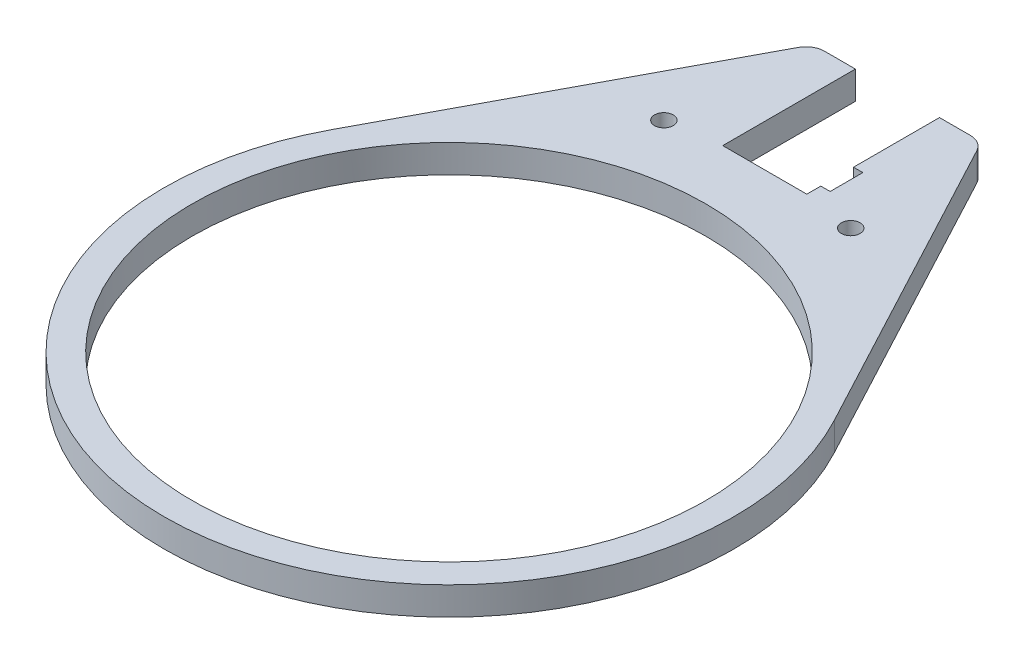
ISO-10303-21;
HEADER;
FILE_DESCRIPTION(('STEP AP214'),'2;1');
FILE_NAME('part.step','',(''),(''),'','','');
FILE_SCHEMA(('AUTOMOTIVE_DESIGN { 1 0 10303 214 1 1 1 1 }'));
ENDSEC;
DATA;
#1=APPLICATION_CONTEXT('core data for automotive mechanical design processes');
#2=APPLICATION_PROTOCOL_DEFINITION('international standard','automotive_design',2000,#1);
#3=PRODUCT_CONTEXT('',#1,'mechanical');
#4=PRODUCT('Part','Part','',(#3));
#5=PRODUCT_RELATED_PRODUCT_CATEGORY('part','',(#4));
#6=PRODUCT_DEFINITION_FORMATION('','',#4);
#7=PRODUCT_DEFINITION_CONTEXT('part definition',#1,'design');
#8=PRODUCT_DEFINITION('design','',#6,#7);
#9=PRODUCT_DEFINITION_SHAPE('','',#8);
#10=(LENGTH_UNIT() NAMED_UNIT(*) SI_UNIT(.MILLI.,.METRE.));
#11=(NAMED_UNIT(*) PLANE_ANGLE_UNIT() SI_UNIT($,.RADIAN.));
#12=(NAMED_UNIT(*) SI_UNIT($,.STERADIAN.) SOLID_ANGLE_UNIT());
#13=UNCERTAINTY_MEASURE_WITH_UNIT(LENGTH_MEASURE(1.E-05),#10,'distance_accuracy_value','');
#14=(GEOMETRIC_REPRESENTATION_CONTEXT(3) GLOBAL_UNCERTAINTY_ASSIGNED_CONTEXT((#13)) GLOBAL_UNIT_ASSIGNED_CONTEXT((#10,
#11,#12)) REPRESENTATION_CONTEXT('',''));
#15=CARTESIAN_POINT('',(0.,0.,0.));
#16=DIRECTION('',(0.,0.,1.));
#17=DIRECTION('',(1.,0.,0.));
#18=AXIS2_PLACEMENT_3D('',#15,#16,#17);
#19=CARTESIAN_POINT('',(4.5,3.,-62.2));
#20=DIRECTION('',(1.,0.,0.));
#21=DIRECTION('',(0.,0.,-1.));
#22=AXIS2_PLACEMENT_3D('',#19,#20,#21);
#23=PLANE('',#22);
#24=DIRECTION('',(0.,0.,1.));
#25=VECTOR('',#24,1.);
#26=CARTESIAN_POINT('',(4.5,0.,-62.2));
#27=LINE('',#26,#25);
#28=CARTESIAN_POINT('',(4.5,0.,-48.));
#29=VERTEX_POINT('',#28);
#30=CARTESIAN_POINT('',(4.5,0.,-38.8));
#31=VERTEX_POINT('',#30);
#32=EDGE_CURVE('E182',#29,#31,#27,.T.);
#33=ORIENTED_EDGE('',*,*,#32,.T.);
#34=DIRECTION('',(0.,1.,0.));
#35=VECTOR('',#34,1.);
#36=CARTESIAN_POINT('',(4.5,3.,-38.8));
#37=LINE('',#36,#35);
#38=CARTESIAN_POINT('',(4.5,3.,-38.8));
#39=VERTEX_POINT('',#38);
#40=EDGE_CURVE('E12',#31,#39,#37,.T.);
#41=ORIENTED_EDGE('',*,*,#40,.T.);
#42=DIRECTION('',(0.,0.,1.));
#43=VECTOR('',#42,1.);
#44=CARTESIAN_POINT('',(4.5,3.,-62.2));
#45=LINE('',#44,#43);
#46=CARTESIAN_POINT('',(4.5,3.,-48.));
#47=VERTEX_POINT('',#46);
#48=EDGE_CURVE('E172',#47,#39,#45,.T.);
#49=ORIENTED_EDGE('',*,*,#48,.F.);
#50=DIRECTION('',(0.,-1.,0.));
#51=VECTOR('',#50,1.);
#52=CARTESIAN_POINT('',(4.5,3.,-48.));
#53=LINE('',#52,#51);
#54=EDGE_CURVE('E247',#47,#29,#53,.T.);
#55=ORIENTED_EDGE('',*,*,#54,.T.);
#56=EDGE_LOOP('',(#33,#41,#49,#55));
#57=FACE_BOUND('',#56,.T.);
#58=ADVANCED_FACE('F37',(#57),#23,.F.);
#59=CARTESIAN_POINT('',(-7.79895069836721,3.,-48.));
#60=DIRECTION('',(0.,0.,-1.));
#61=DIRECTION('',(-1.,0.,0.));
#62=AXIS2_PLACEMENT_3D('',#59,#60,#61);
#63=PLANE('',#62);
#64=ORIENTED_EDGE('',*,*,#54,.F.);
#65=DIRECTION('',(1.,0.,0.));
#66=VECTOR('',#65,1.);
#67=CARTESIAN_POINT('',(-7.79895069836721,3.,-48.));
#68=LINE('',#67,#66);
#69=CARTESIAN_POINT('',(7.79895069836721,3.,-48.));
#70=VERTEX_POINT('',#69);
#71=EDGE_CURVE('E201',#47,#70,#68,.T.);
#72=ORIENTED_EDGE('',*,*,#71,.T.);
#73=DIRECTION('',(0.,-1.,0.));
#74=VECTOR('',#73,1.);
#75=CARTESIAN_POINT('',(7.79895069836721,3.,-48.));
#76=LINE('',#75,#74);
#77=CARTESIAN_POINT('',(7.79895069836721,0.,-48.));
#78=VERTEX_POINT('',#77);
#79=EDGE_CURVE('E232',#70,#78,#76,.T.);
#80=ORIENTED_EDGE('',*,*,#79,.T.);
#81=DIRECTION('',(1.,0.,0.));
#82=VECTOR('',#81,1.);
#83=CARTESIAN_POINT('',(-7.79895069836721,0.,-48.));
#84=LINE('',#83,#82);
#85=EDGE_CURVE('E217',#29,#78,#84,.T.);
#86=ORIENTED_EDGE('',*,*,#85,.F.);
#87=EDGE_LOOP('',(#64,#72,#80,#86));
#88=FACE_BOUND('',#87,.T.);
#89=ADVANCED_FACE('F287',(#88),#63,.T.);
#90=CARTESIAN_POINT('',(0.,1.,0.));
#91=DIRECTION('',(0.,-1.,0.));
#92=DIRECTION('',(0.,0.,-1.));
#93=AXIS2_PLACEMENT_3D('',#90,#91,#92);
#94=CYLINDRICAL_SURFACE('',#93,30.4999999999999);
#95=DIRECTION('',(0.,-1.,0.));
#96=VECTOR('',#95,1.);
#97=CARTESIAN_POINT('',(26.9228280798421,3.,-14.332178068363));
#98=LINE('',#97,#96);
#99=CARTESIAN_POINT('',(26.9228280798421,3.,-14.332178068363));
#100=VERTEX_POINT('',#99);
#101=CARTESIAN_POINT('',(26.9228280798421,0.,-14.332178068363));
#102=VERTEX_POINT('',#101);
#103=EDGE_CURVE('E226',#100,#102,#98,.T.);
#104=ORIENTED_EDGE('',*,*,#103,.F.);
#105=CARTESIAN_POINT('',(0.,3.,0.));
#106=DIRECTION('',(0.,1.,0.));
#107=DIRECTION('',(0.,0.,1.));
#108=AXIS2_PLACEMENT_3D('',#105,#106,#107);
#109=CIRCLE('',#108,30.4999999999999);
#110=CARTESIAN_POINT('',(-26.9228280798421,3.,-14.332178068363));
#111=VERTEX_POINT('',#110);
#112=EDGE_CURVE('E229',#111,#100,#109,.T.);
#113=ORIENTED_EDGE('',*,*,#112,.F.);
#114=DIRECTION('',(0.,-1.,0.));
#115=VECTOR('',#114,1.);
#116=CARTESIAN_POINT('',(-26.9228280798421,3.,-14.332178068363));
#117=LINE('',#116,#115);
#118=CARTESIAN_POINT('',(-26.9228280798421,0.,-14.332178068363));
#119=VERTEX_POINT('',#118);
#120=EDGE_CURVE('E211',#111,#119,#117,.T.);
#121=ORIENTED_EDGE('',*,*,#120,.T.);
#122=CARTESIAN_POINT('',(0.,0.,0.));
#123=DIRECTION('',(0.,1.,0.));
#124=DIRECTION('',(0.,0.,1.));
#125=AXIS2_PLACEMENT_3D('',#122,#123,#124);
#126=CIRCLE('',#125,30.4999999999999);
#127=EDGE_CURVE('E243',#119,#102,#126,.T.);
#128=ORIENTED_EDGE('',*,*,#127,.T.);
#129=EDGE_LOOP('',(#104,#113,#121,#128));
#130=FACE_BOUND('',#129,.T.);
#131=ADVANCED_FACE('F39',(#130),#94,.T.);
#132=CARTESIAN_POINT('',(22.5,0.,-33.6749164809655));
#133=DIRECTION('',(0.,1.,0.));
#134=DIRECTION('',(0.,0.,1.));
#135=AXIS2_PLACEMENT_3D('',#132,#133,#134);
#136=PLANE('',#135);
#137=CARTESIAN_POINT('',(-10.,0.,-33.));
#138=DIRECTION('',(0.,1.,0.));
#139=DIRECTION('',(0.,0.,1.));
#140=AXIS2_PLACEMENT_3D('',#137,#138,#139);
#141=CIRCLE('',#140,1.);
#142=CARTESIAN_POINT('',(-10.,0.,-32.));
#143=VERTEX_POINT('',#142);
#144=EDGE_CURVE('E251',#143,#143,#141,.T.);
#145=ORIENTED_EDGE('',*,*,#144,.T.);
#146=EDGE_LOOP('',(#145));
#147=FACE_BOUND('',#146,.T.);
#148=CARTESIAN_POINT('',(10.,0.,-33.));
#149=DIRECTION('',(0.,1.,0.));
#150=DIRECTION('',(0.,0.,1.));
#151=AXIS2_PLACEMENT_3D('',#148,#149,#150);
#152=CIRCLE('',#151,1.);
#153=CARTESIAN_POINT('',(10.,0.,-32.));
#154=VERTEX_POINT('',#153);
#155=EDGE_CURVE('E257',#154,#154,#152,.T.);
#156=ORIENTED_EDGE('',*,*,#155,.T.);
#157=EDGE_LOOP('',(#156));
#158=FACE_BOUND('',#157,.T.);
#159=CARTESIAN_POINT('',(0.,0.,0.));
#160=DIRECTION('',(0.,1.,0.));
#161=DIRECTION('',(0.,0.,1.));
#162=AXIS2_PLACEMENT_3D('',#159,#160,#161);
#163=CIRCLE('',#162,27.4999999999999);
#164=CARTESIAN_POINT('',(0.,0.,27.4999999999999));
#165=VERTEX_POINT('',#164);
#166=EDGE_CURVE('E157',#165,#165,#163,.T.);
#167=ORIENTED_EDGE('',*,*,#166,.T.);
#168=EDGE_LOOP('',(#167));
#169=FACE_BOUND('',#168,.T.);
#170=DIRECTION('',(0.,0.,-1.));
#171=VECTOR('',#170,1.);
#172=CARTESIAN_POINT('',(5.5,0.,-33.6749164809655));
#173=LINE('',#172,#171);
#174=CARTESIAN_POINT('',(5.5,0.,-35.3));
#175=VERTEX_POINT('',#174);
#176=CARTESIAN_POINT('',(5.5,0.,-38.8));
#177=VERTEX_POINT('',#176);
#178=EDGE_CURVE('E148',#175,#177,#173,.T.);
#179=ORIENTED_EDGE('',*,*,#178,.T.);
#180=DIRECTION('',(-1.,0.,0.));
#181=VECTOR('',#180,1.);
#182=CARTESIAN_POINT('',(22.5,0.,-38.8));
#183=LINE('',#182,#181);
#184=EDGE_CURVE('E167',#177,#31,#183,.T.);
#185=ORIENTED_EDGE('',*,*,#184,.T.);
#186=ORIENTED_EDGE('',*,*,#32,.F.);
#187=ORIENTED_EDGE('',*,*,#85,.T.);
#188=CARTESIAN_POINT('',(7.79895069836721,0.,-46.));
#189=DIRECTION('',(0.,-1.,0.));
#190=DIRECTION('',(0.,0.,-1.));
#191=AXIS2_PLACEMENT_3D('',#188,#189,#190);
#192=CIRCLE('',#191,2.);
#193=CARTESIAN_POINT('',(9.56438204786505,0.,-46.9398149553025));
#194=VERTEX_POINT('',#193);
#195=EDGE_CURVE('E221',#78,#194,#192,.T.);
#196=ORIENTED_EDGE('',*,*,#195,.T.);
#197=DIRECTION('',(0.469907477651243,0.,0.882715674748923));
#198=VECTOR('',#197,1.);
#199=CARTESIAN_POINT('',(9.56438204786505,0.,-46.9398149553025));
#200=LINE('',#199,#198);
#201=EDGE_CURVE('E198',#194,#102,#200,.T.);
#202=ORIENTED_EDGE('',*,*,#201,.T.);
#203=ORIENTED_EDGE('',*,*,#127,.F.);
#204=DIRECTION('',(0.469907477651243,0.,-0.882715674748923));
#205=VECTOR('',#204,1.);
#206=CARTESIAN_POINT('',(-26.9228280798421,0.,-14.332178068363));
#207=LINE('',#206,#205);
#208=CARTESIAN_POINT('',(-9.56438204786506,0.,-46.9398149553025));
#209=VERTEX_POINT('',#208);
#210=EDGE_CURVE('E191',#119,#209,#207,.T.);
#211=ORIENTED_EDGE('',*,*,#210,.T.);
#212=CARTESIAN_POINT('',(-7.79895069836721,0.,-46.));
#213=DIRECTION('',(0.,-1.,0.));
#214=DIRECTION('',(0.,0.,1.));
#215=AXIS2_PLACEMENT_3D('',#212,#213,#214);
#216=CIRCLE('',#215,2.);
#217=CARTESIAN_POINT('',(-7.79895069836721,0.,-48.));
#218=VERTEX_POINT('',#217);
#219=EDGE_CURVE('E214',#209,#218,#216,.T.);
#220=ORIENTED_EDGE('',*,*,#219,.T.);
#221=CARTESIAN_POINT('',(-4.5,0.,-48.));
#222=VERTEX_POINT('',#221);
#223=EDGE_CURVE('E218',#218,#222,#84,.T.);
#224=ORIENTED_EDGE('',*,*,#223,.T.);
#225=DIRECTION('',(0.,0.,-1.));
#226=VECTOR('',#225,1.);
#227=CARTESIAN_POINT('',(-4.5,0.,-62.2));
#228=LINE('',#227,#226);
#229=CARTESIAN_POINT('',(-4.5,0.,-33.8));
#230=VERTEX_POINT('',#229);
#231=EDGE_CURVE('E62',#230,#222,#228,.T.);
#232=ORIENTED_EDGE('',*,*,#231,.F.);
#233=DIRECTION('',(-1.,0.,0.));
#234=VECTOR('',#233,1.);
#235=CARTESIAN_POINT('',(-4.5,0.,-33.8));
#236=LINE('',#235,#234);
#237=CARTESIAN_POINT('',(4.5,0.,-33.8));
#238=VERTEX_POINT('',#237);
#239=EDGE_CURVE('E185',#238,#230,#236,.T.);
#240=ORIENTED_EDGE('',*,*,#239,.F.);
#241=CARTESIAN_POINT('',(4.5,0.,-35.3));
#242=VERTEX_POINT('',#241);
#243=EDGE_CURVE('E171',#242,#238,#27,.T.);
#244=ORIENTED_EDGE('',*,*,#243,.F.);
#245=DIRECTION('',(1.,0.,0.));
#246=VECTOR('',#245,1.);
#247=CARTESIAN_POINT('',(22.5,0.,-35.3));
#248=LINE('',#247,#246);
#249=EDGE_CURVE('E54',#242,#175,#248,.T.);
#250=ORIENTED_EDGE('',*,*,#249,.T.);
#251=EDGE_LOOP('',(#179,#185,#186,#187,#196,#202,#203,#211,#220,#224,#232,#240,#244,#250));
#252=FACE_BOUND('',#251,.T.);
#253=ADVANCED_FACE('F268',(#147,#158,#169,#252),#136,.F.);
#254=CARTESIAN_POINT('',(22.5,3.,-33.6749164809655));
#255=DIRECTION('',(0.,1.,0.));
#256=DIRECTION('',(0.,0.,1.));
#257=AXIS2_PLACEMENT_3D('',#254,#255,#256);
#258=PLANE('',#257);
#259=CARTESIAN_POINT('',(-10.,3.,-33.));
#260=DIRECTION('',(0.,1.,0.));
#261=DIRECTION('',(0.,0.,1.));
#262=AXIS2_PLACEMENT_3D('',#259,#260,#261);
#263=CIRCLE('',#262,1.);
#264=CARTESIAN_POINT('',(-10.,3.,-32.));
#265=VERTEX_POINT('',#264);
#266=EDGE_CURVE('E41',#265,#265,#263,.T.);
#267=ORIENTED_EDGE('',*,*,#266,.F.);
#268=EDGE_LOOP('',(#267));
#269=FACE_BOUND('',#268,.T.);
#270=CARTESIAN_POINT('',(10.,3.,-33.));
#271=DIRECTION('',(0.,1.,0.));
#272=DIRECTION('',(0.,0.,1.));
#273=AXIS2_PLACEMENT_3D('',#270,#271,#272);
#274=CIRCLE('',#273,1.);
#275=CARTESIAN_POINT('',(10.,3.,-32.));
#276=VERTEX_POINT('',#275);
#277=EDGE_CURVE('E249',#276,#276,#274,.T.);
#278=ORIENTED_EDGE('',*,*,#277,.F.);
#279=EDGE_LOOP('',(#278));
#280=FACE_BOUND('',#279,.T.);
#281=CARTESIAN_POINT('',(0.,3.,0.));
#282=DIRECTION('',(0.,-1.,0.));
#283=DIRECTION('',(0.,0.,-1.));
#284=AXIS2_PLACEMENT_3D('',#281,#282,#283);
#285=CIRCLE('',#284,27.4999999999999);
#286=CARTESIAN_POINT('',(0.,3.,-27.4999999999999));
#287=VERTEX_POINT('',#286);
#288=EDGE_CURVE('E255',#287,#287,#285,.T.);
#289=ORIENTED_EDGE('',*,*,#288,.T.);
#290=EDGE_LOOP('',(#289));
#291=FACE_BOUND('',#290,.T.);
#292=DIRECTION('',(-1.,0.,0.));
#293=VECTOR('',#292,1.);
#294=CARTESIAN_POINT('',(0.,3.,-38.8));
#295=LINE('',#294,#293);
#296=CARTESIAN_POINT('',(5.5,3.,-38.8));
#297=VERTEX_POINT('',#296);
#298=EDGE_CURVE('E150',#297,#39,#295,.T.);
#299=ORIENTED_EDGE('',*,*,#298,.F.);
#300=DIRECTION('',(0.,0.,-1.));
#301=VECTOR('',#300,1.);
#302=CARTESIAN_POINT('',(5.5,3.,0.));
#303=LINE('',#302,#301);
#304=CARTESIAN_POINT('',(5.5,3.,-35.3));
#305=VERTEX_POINT('',#304);
#306=EDGE_CURVE('E145',#305,#297,#303,.T.);
#307=ORIENTED_EDGE('',*,*,#306,.F.);
#308=DIRECTION('',(1.,0.,0.));
#309=VECTOR('',#308,1.);
#310=CARTESIAN_POINT('',(0.,3.,-35.3));
#311=LINE('',#310,#309);
#312=CARTESIAN_POINT('',(4.5,3.,-35.3));
#313=VERTEX_POINT('',#312);
#314=EDGE_CURVE('E153',#313,#305,#311,.T.);
#315=ORIENTED_EDGE('',*,*,#314,.F.);
#316=CARTESIAN_POINT('',(4.5,3.,-33.8));
#317=VERTEX_POINT('',#316);
#318=EDGE_CURVE('E175',#313,#317,#45,.T.);
#319=ORIENTED_EDGE('',*,*,#318,.T.);
#320=DIRECTION('',(-1.,0.,0.));
#321=VECTOR('',#320,1.);
#322=CARTESIAN_POINT('',(-4.5,3.,-33.8));
#323=LINE('',#322,#321);
#324=CARTESIAN_POINT('',(-4.5,3.,-33.8));
#325=VERTEX_POINT('',#324);
#326=EDGE_CURVE('E174',#317,#325,#323,.T.);
#327=ORIENTED_EDGE('',*,*,#326,.T.);
#328=DIRECTION('',(0.,0.,-1.));
#329=VECTOR('',#328,1.);
#330=CARTESIAN_POINT('',(-4.5,3.,-62.2));
#331=LINE('',#330,#329);
#332=CARTESIAN_POINT('',(-4.5,3.,-48.));
#333=VERTEX_POINT('',#332);
#334=EDGE_CURVE('E178',#325,#333,#331,.T.);
#335=ORIENTED_EDGE('',*,*,#334,.T.);
#336=CARTESIAN_POINT('',(-7.79895069836721,3.,-48.));
#337=VERTEX_POINT('',#336);
#338=EDGE_CURVE('E202',#337,#333,#68,.T.);
#339=ORIENTED_EDGE('',*,*,#338,.F.);
#340=CARTESIAN_POINT('',(-7.79895069836721,3.,-46.));
#341=DIRECTION('',(0.,-1.,0.));
#342=DIRECTION('',(0.,0.,1.));
#343=AXIS2_PLACEMENT_3D('',#340,#341,#342);
#344=CIRCLE('',#343,2.);
#345=CARTESIAN_POINT('',(-9.56438204786506,3.,-46.9398149553025));
#346=VERTEX_POINT('',#345);
#347=EDGE_CURVE('E197',#346,#337,#344,.T.);
#348=ORIENTED_EDGE('',*,*,#347,.F.);
#349=DIRECTION('',(0.469907477651243,0.,-0.882715674748923));
#350=VECTOR('',#349,1.);
#351=CARTESIAN_POINT('',(-26.9228280798421,3.,-14.332178068363));
#352=LINE('',#351,#350);
#353=EDGE_CURVE('E194',#111,#346,#352,.T.);
#354=ORIENTED_EDGE('',*,*,#353,.F.);
#355=ORIENTED_EDGE('',*,*,#112,.T.);
#356=DIRECTION('',(0.469907477651243,0.,0.882715674748923));
#357=VECTOR('',#356,1.);
#358=CARTESIAN_POINT('',(9.56438204786505,3.,-46.9398149553025));
#359=LINE('',#358,#357);
#360=CARTESIAN_POINT('',(9.56438204786505,3.,-46.9398149553025));
#361=VERTEX_POINT('',#360);
#362=EDGE_CURVE('E208',#361,#100,#359,.T.);
#363=ORIENTED_EDGE('',*,*,#362,.F.);
#364=CARTESIAN_POINT('',(7.79895069836721,3.,-46.));
#365=DIRECTION('',(0.,-1.,0.));
#366=DIRECTION('',(0.,0.,-1.));
#367=AXIS2_PLACEMENT_3D('',#364,#365,#366);
#368=CIRCLE('',#367,2.);
#369=EDGE_CURVE('E205',#70,#361,#368,.T.);
#370=ORIENTED_EDGE('',*,*,#369,.F.);
#371=ORIENTED_EDGE('',*,*,#71,.F.);
#372=ORIENTED_EDGE('',*,*,#48,.T.);
#373=EDGE_LOOP('',(#299,#307,#315,#319,#327,#335,#339,#348,#354,#355,#363,#370,#371,#372));
#374=FACE_BOUND('',#373,.T.);
#375=ADVANCED_FACE('F159',(#269,#280,#291,#374),#258,.T.);
#376=CARTESIAN_POINT('',(9.56438204786505,3.,-46.9398149553025));
#377=DIRECTION('',(0.882715674748923,0.,-0.469907477651243));
#378=DIRECTION('',(-0.469907477651243,0.,-0.882715674748923));
#379=AXIS2_PLACEMENT_3D('',#376,#377,#378);
#380=PLANE('',#379);
#381=ORIENTED_EDGE('',*,*,#201,.F.);
#382=DIRECTION('',(0.,-1.,0.));
#383=VECTOR('',#382,1.);
#384=CARTESIAN_POINT('',(9.56438204786505,3.,-46.9398149553025));
#385=LINE('',#384,#383);
#386=EDGE_CURVE('E230',#361,#194,#385,.T.);
#387=ORIENTED_EDGE('',*,*,#386,.F.);
#388=ORIENTED_EDGE('',*,*,#362,.T.);
#389=ORIENTED_EDGE('',*,*,#103,.T.);
#390=EDGE_LOOP('',(#381,#387,#388,#389));
#391=FACE_BOUND('',#390,.T.);
#392=ADVANCED_FACE('F332',(#391),#380,.T.);
#393=CARTESIAN_POINT('',(7.79895069836721,3.,-46.));
#394=DIRECTION('',(0.,-1.,0.));
#395=DIRECTION('',(0.,0.,-1.));
#396=AXIS2_PLACEMENT_3D('',#393,#394,#395);
#397=CYLINDRICAL_SURFACE('',#396,2.);
#398=ORIENTED_EDGE('',*,*,#195,.F.);
#399=ORIENTED_EDGE('',*,*,#79,.F.);
#400=ORIENTED_EDGE('',*,*,#369,.T.);
#401=ORIENTED_EDGE('',*,*,#386,.T.);
#402=EDGE_LOOP('',(#398,#399,#400,#401));
#403=FACE_BOUND('',#402,.T.);
#404=ADVANCED_FACE('F335',(#403),#397,.T.);
#405=DIRECTION('',(0.,1.,0.));
#406=VECTOR('',#405,1.);
#407=CARTESIAN_POINT('',(-4.5,3.,-48.));
#408=LINE('',#407,#406);
#409=EDGE_CURVE('E245',#222,#333,#408,.T.);
#410=ORIENTED_EDGE('',*,*,#409,.F.);
#411=ORIENTED_EDGE('',*,*,#223,.F.);
#412=DIRECTION('',(0.,-1.,0.));
#413=VECTOR('',#412,1.);
#414=CARTESIAN_POINT('',(-7.79895069836721,3.,-48.));
#415=LINE('',#414,#413);
#416=EDGE_CURVE('E235',#337,#218,#415,.T.);
#417=ORIENTED_EDGE('',*,*,#416,.F.);
#418=ORIENTED_EDGE('',*,*,#338,.T.);
#419=EDGE_LOOP('',(#410,#411,#417,#418));
#420=FACE_BOUND('',#419,.T.);
#421=ADVANCED_FACE('F296',(#420),#63,.T.);
#422=CARTESIAN_POINT('',(-7.79895069836721,3.,-46.));
#423=DIRECTION('',(0.,-1.,0.));
#424=DIRECTION('',(0.,0.,-1.));
#425=AXIS2_PLACEMENT_3D('',#422,#423,#424);
#426=CYLINDRICAL_SURFACE('',#425,2.);
#427=ORIENTED_EDGE('',*,*,#219,.F.);
#428=DIRECTION('',(0.,-1.,0.));
#429=VECTOR('',#428,1.);
#430=CARTESIAN_POINT('',(-9.56438204786506,3.,-46.9398149553025));
#431=LINE('',#430,#429);
#432=EDGE_CURVE('E237',#346,#209,#431,.T.);
#433=ORIENTED_EDGE('',*,*,#432,.F.);
#434=ORIENTED_EDGE('',*,*,#347,.T.);
#435=ORIENTED_EDGE('',*,*,#416,.T.);
#436=EDGE_LOOP('',(#427,#433,#434,#435));
#437=FACE_BOUND('',#436,.T.);
#438=ADVANCED_FACE('F309',(#437),#426,.T.);
#439=CARTESIAN_POINT('',(-26.9228280798421,3.,-14.332178068363));
#440=DIRECTION('',(-0.882715674748923,0.,-0.469907477651243));
#441=DIRECTION('',(-0.469907477651243,0.,0.882715674748923));
#442=AXIS2_PLACEMENT_3D('',#439,#440,#441);
#443=PLANE('',#442);
#444=ORIENTED_EDGE('',*,*,#210,.F.);
#445=ORIENTED_EDGE('',*,*,#120,.F.);
#446=ORIENTED_EDGE('',*,*,#353,.T.);
#447=ORIENTED_EDGE('',*,*,#432,.T.);
#448=EDGE_LOOP('',(#444,#445,#446,#447));
#449=FACE_BOUND('',#448,.T.);
#450=ADVANCED_FACE('F301',(#449),#443,.T.);
#451=ORIENTED_EDGE('',*,*,#318,.F.);
#452=DIRECTION('',(0.,-1.,0.));
#453=VECTOR('',#452,1.);
#454=CARTESIAN_POINT('',(4.5,3.,-35.3));
#455=LINE('',#454,#453);
#456=EDGE_CURVE('E46',#313,#242,#455,.T.);
#457=ORIENTED_EDGE('',*,*,#456,.T.);
#458=ORIENTED_EDGE('',*,*,#243,.T.);
#459=DIRECTION('',(0.,-1.,0.));
#460=VECTOR('',#459,1.);
#461=CARTESIAN_POINT('',(4.5,3.,-33.8));
#462=LINE('',#461,#460);
#463=EDGE_CURVE('E181',#317,#238,#462,.T.);
#464=ORIENTED_EDGE('',*,*,#463,.F.);
#465=EDGE_LOOP('',(#451,#457,#458,#464));
#466=FACE_BOUND('',#465,.T.);
#467=ADVANCED_FACE('F290',(#466),#23,.F.);
#468=CARTESIAN_POINT('',(-4.5,3.,-62.2));
#469=DIRECTION('',(-1.,0.,0.));
#470=DIRECTION('',(0.,0.,1.));
#471=AXIS2_PLACEMENT_3D('',#468,#469,#470);
#472=PLANE('',#471);
#473=ORIENTED_EDGE('',*,*,#409,.T.);
#474=ORIENTED_EDGE('',*,*,#334,.F.);
#475=DIRECTION('',(0.,-1.,0.));
#476=VECTOR('',#475,1.);
#477=CARTESIAN_POINT('',(-4.5,3.,-33.8));
#478=LINE('',#477,#476);
#479=EDGE_CURVE('E189',#325,#230,#478,.T.);
#480=ORIENTED_EDGE('',*,*,#479,.T.);
#481=ORIENTED_EDGE('',*,*,#231,.T.);
#482=EDGE_LOOP('',(#473,#474,#480,#481));
#483=FACE_BOUND('',#482,.T.);
#484=ADVANCED_FACE('F300',(#483),#472,.F.);
#485=CARTESIAN_POINT('',(-4.5,3.,-33.8));
#486=DIRECTION('',(0.,0.,1.));
#487=DIRECTION('',(1.,0.,0.));
#488=AXIS2_PLACEMENT_3D('',#485,#486,#487);
#489=PLANE('',#488);
#490=ORIENTED_EDGE('',*,*,#239,.T.);
#491=ORIENTED_EDGE('',*,*,#479,.F.);
#492=ORIENTED_EDGE('',*,*,#326,.F.);
#493=ORIENTED_EDGE('',*,*,#463,.T.);
#494=EDGE_LOOP('',(#490,#491,#492,#493));
#495=FACE_BOUND('',#494,.T.);
#496=ADVANCED_FACE('F307',(#495),#489,.F.);
#497=CARTESIAN_POINT('',(5.5,-10.,0.));
#498=DIRECTION('',(1.,0.,0.));
#499=DIRECTION('',(0.,0.,-1.));
#500=AXIS2_PLACEMENT_3D('',#497,#498,#499);
#501=PLANE('',#500);
#502=DIRECTION('',(0.,1.,0.));
#503=VECTOR('',#502,1.);
#504=CARTESIAN_POINT('',(5.5,-10.,-35.3));
#505=LINE('',#504,#503);
#506=EDGE_CURVE('E140',#175,#305,#505,.T.);
#507=ORIENTED_EDGE('',*,*,#506,.T.);
#508=ORIENTED_EDGE('',*,*,#306,.T.);
#509=DIRECTION('',(0.,1.,0.));
#510=VECTOR('',#509,1.);
#511=CARTESIAN_POINT('',(5.5,-10.,-38.8));
#512=LINE('',#511,#510);
#513=EDGE_CURVE('E149',#177,#297,#512,.T.);
#514=ORIENTED_EDGE('',*,*,#513,.F.);
#515=ORIENTED_EDGE('',*,*,#178,.F.);
#516=EDGE_LOOP('',(#507,#508,#514,#515));
#517=FACE_BOUND('',#516,.T.);
#518=ADVANCED_FACE('F142',(#517),#501,.F.);
#519=CARTESIAN_POINT('',(0.,-10.,-38.8));
#520=DIRECTION('',(0.,0.,-1.));
#521=DIRECTION('',(-1.,0.,0.));
#522=AXIS2_PLACEMENT_3D('',#519,#520,#521);
#523=PLANE('',#522);
#524=ORIENTED_EDGE('',*,*,#513,.T.);
#525=ORIENTED_EDGE('',*,*,#298,.T.);
#526=ORIENTED_EDGE('',*,*,#40,.F.);
#527=ORIENTED_EDGE('',*,*,#184,.F.);
#528=EDGE_LOOP('',(#524,#525,#526,#527));
#529=FACE_BOUND('',#528,.T.);
#530=ADVANCED_FACE('F282',(#529),#523,.F.);
#531=CARTESIAN_POINT('',(0.,-10.,-35.3));
#532=DIRECTION('',(0.,0.,1.));
#533=DIRECTION('',(1.,0.,0.));
#534=AXIS2_PLACEMENT_3D('',#531,#532,#533);
#535=PLANE('',#534);
#536=ORIENTED_EDGE('',*,*,#456,.F.);
#537=ORIENTED_EDGE('',*,*,#314,.T.);
#538=ORIENTED_EDGE('',*,*,#506,.F.);
#539=ORIENTED_EDGE('',*,*,#249,.F.);
#540=EDGE_LOOP('',(#536,#537,#538,#539));
#541=FACE_BOUND('',#540,.T.);
#542=ADVANCED_FACE('F154',(#541),#535,.F.);
#543=CARTESIAN_POINT('',(0.,3.,0.));
#544=DIRECTION('',(0.,-1.,0.));
#545=DIRECTION('',(0.,0.,-1.));
#546=AXIS2_PLACEMENT_3D('',#543,#544,#545);
#547=CYLINDRICAL_SURFACE('',#546,27.4999999999999);
#548=ORIENTED_EDGE('',*,*,#288,.F.);
#549=EDGE_LOOP('',(#548));
#550=FACE_BOUND('',#549,.T.);
#551=ORIENTED_EDGE('',*,*,#166,.F.);
#552=EDGE_LOOP('',(#551));
#553=FACE_BOUND('',#552,.T.);
#554=ADVANCED_FACE('F271',(#550,#553),#547,.F.);
#555=CARTESIAN_POINT('',(10.,0.,-33.));
#556=DIRECTION('',(0.,1.,0.));
#557=DIRECTION('',(0.,0.,1.));
#558=AXIS2_PLACEMENT_3D('',#555,#556,#557);
#559=CYLINDRICAL_SURFACE('',#558,1.);
#560=ORIENTED_EDGE('',*,*,#277,.T.);
#561=EDGE_LOOP('',(#560));
#562=FACE_BOUND('',#561,.T.);
#563=ORIENTED_EDGE('',*,*,#155,.F.);
#564=EDGE_LOOP('',(#563));
#565=FACE_BOUND('',#564,.T.);
#566=ADVANCED_FACE('F273',(#562,#565),#559,.F.);
#567=CARTESIAN_POINT('',(-10.,0.,-33.));
#568=DIRECTION('',(0.,1.,0.));
#569=DIRECTION('',(0.,0.,1.));
#570=AXIS2_PLACEMENT_3D('',#567,#568,#569);
#571=CYLINDRICAL_SURFACE('',#570,1.);
#572=ORIENTED_EDGE('',*,*,#266,.T.);
#573=EDGE_LOOP('',(#572));
#574=FACE_BOUND('',#573,.T.);
#575=ORIENTED_EDGE('',*,*,#144,.F.);
#576=EDGE_LOOP('',(#575));
#577=FACE_BOUND('',#576,.T.);
#578=ADVANCED_FACE('F280',(#574,#577),#571,.F.);
#579=CLOSED_SHELL('',(#58,#89,#131,#253,#375,#392,#404,#421,#438,#450,#467,#484,#496,#518,#530,
#542,#554,#566,#578));
#580=MANIFOLD_SOLID_BREP('B2',#579);
#581=ADVANCED_BREP_SHAPE_REPRESENTATION('',(#18,#580),#14);
#582=SHAPE_DEFINITION_REPRESENTATION(#9,#581);
ENDSEC;
END-ISO-10303-21;
